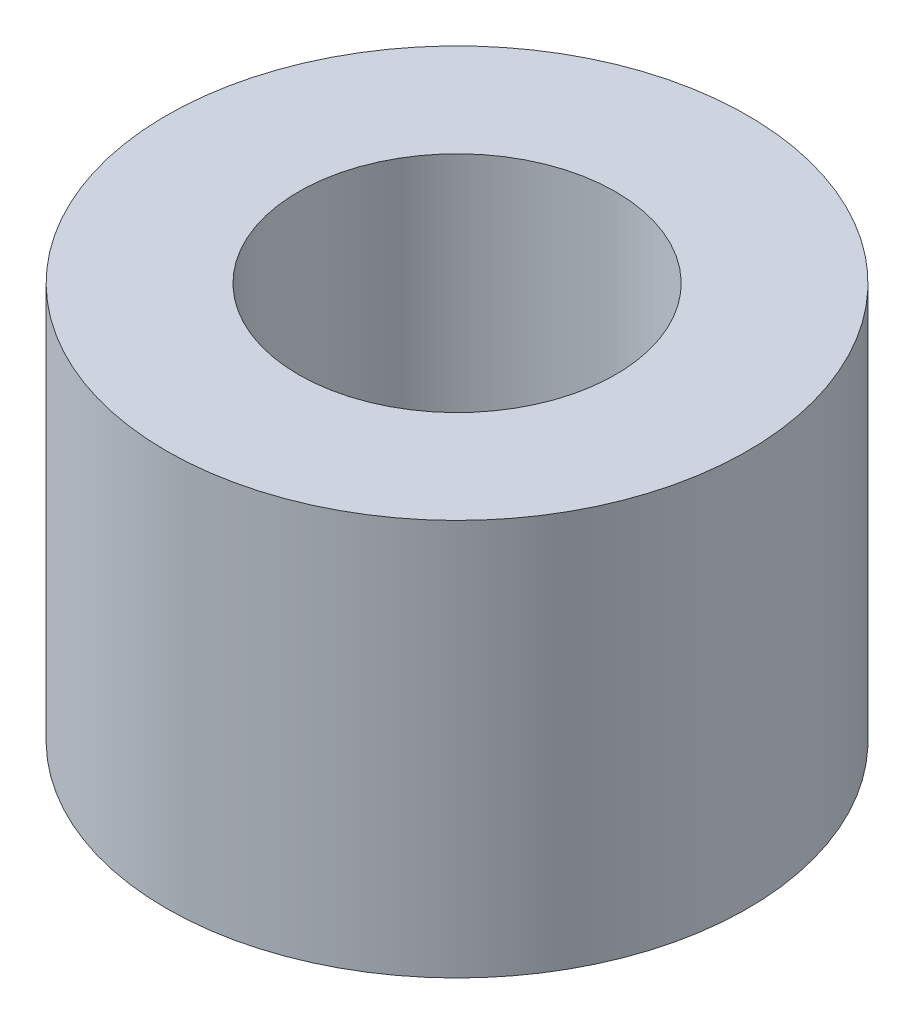
ISO-10303-21;
HEADER;
FILE_DESCRIPTION(('STEP AP214'),'2;1');
FILE_NAME('part.step','',(''),(''),'','','');
FILE_SCHEMA(('AUTOMOTIVE_DESIGN { 1 0 10303 214 1 1 1 1 }'));
ENDSEC;
DATA;
#1=APPLICATION_CONTEXT('core data for automotive mechanical design processes');
#2=APPLICATION_PROTOCOL_DEFINITION('international standard','automotive_design',2000,#1);
#3=PRODUCT_CONTEXT('',#1,'mechanical');
#4=PRODUCT('Part','Part','',(#3));
#5=PRODUCT_RELATED_PRODUCT_CATEGORY('part','',(#4));
#6=PRODUCT_DEFINITION_FORMATION('','',#4);
#7=PRODUCT_DEFINITION_CONTEXT('part definition',#1,'design');
#8=PRODUCT_DEFINITION('design','',#6,#7);
#9=PRODUCT_DEFINITION_SHAPE('','',#8);
#10=(LENGTH_UNIT() NAMED_UNIT(*) SI_UNIT(.MILLI.,.METRE.));
#11=(NAMED_UNIT(*) PLANE_ANGLE_UNIT() SI_UNIT($,.RADIAN.));
#12=(NAMED_UNIT(*) SI_UNIT($,.STERADIAN.) SOLID_ANGLE_UNIT());
#13=UNCERTAINTY_MEASURE_WITH_UNIT(LENGTH_MEASURE(1.E-05),#10,'distance_accuracy_value','');
#14=(GEOMETRIC_REPRESENTATION_CONTEXT(3) GLOBAL_UNCERTAINTY_ASSIGNED_CONTEXT((#13)) GLOBAL_UNIT_ASSIGNED_CONTEXT((#10,
#11,#12)) REPRESENTATION_CONTEXT('',''));
#15=CARTESIAN_POINT('',(0.,0.,0.));
#16=DIRECTION('',(0.,0.,1.));
#17=DIRECTION('',(1.,0.,0.));
#18=AXIS2_PLACEMENT_3D('',#15,#16,#17);
#19=CARTESIAN_POINT('',(0.,15.,0.));
#20=DIRECTION('',(0.,1.,0.));
#21=DIRECTION('',(0.,0.,1.));
#22=AXIS2_PLACEMENT_3D('',#19,#20,#21);
#23=PLANE('',#22);
#24=CARTESIAN_POINT('',(0.,15.,0.));
#25=DIRECTION('',(0.,1.,0.));
#26=DIRECTION('',(0.,0.,1.));
#27=AXIS2_PLACEMENT_3D('',#24,#25,#26);
#28=CIRCLE('',#27,11.);
#29=CARTESIAN_POINT('',(0.,15.,11.));
#30=VERTEX_POINT('',#29);
#31=EDGE_CURVE('E10',#30,#30,#28,.T.);
#32=ORIENTED_EDGE('',*,*,#31,.T.);
#33=EDGE_LOOP('',(#32));
#34=FACE_BOUND('',#33,.T.);
#35=CARTESIAN_POINT('',(0.,15.,0.));
#36=DIRECTION('',(0.,1.,0.));
#37=DIRECTION('',(0.,0.,1.));
#38=AXIS2_PLACEMENT_3D('',#35,#36,#37);
#39=CIRCLE('',#38,6.);
#40=CARTESIAN_POINT('',(0.,15.,6.));
#41=VERTEX_POINT('',#40);
#42=EDGE_CURVE('E52',#41,#41,#39,.T.);
#43=ORIENTED_EDGE('',*,*,#42,.F.);
#44=EDGE_LOOP('',(#43));
#45=FACE_BOUND('',#44,.T.);
#46=ADVANCED_FACE('F39',(#34,#45),#23,.T.);
#47=CARTESIAN_POINT('',(0.,0.,0.));
#48=DIRECTION('',(0.,1.,0.));
#49=DIRECTION('',(0.,0.,1.));
#50=AXIS2_PLACEMENT_3D('',#47,#48,#49);
#51=PLANE('',#50);
#52=CARTESIAN_POINT('',(0.,0.,0.));
#53=DIRECTION('',(0.,1.,0.));
#54=DIRECTION('',(0.,0.,1.));
#55=AXIS2_PLACEMENT_3D('',#52,#53,#54);
#56=CIRCLE('',#55,11.);
#57=CARTESIAN_POINT('',(0.,0.,11.));
#58=VERTEX_POINT('',#57);
#59=EDGE_CURVE('E43',#58,#58,#56,.T.);
#60=ORIENTED_EDGE('',*,*,#59,.F.);
#61=EDGE_LOOP('',(#60));
#62=FACE_BOUND('',#61,.T.);
#63=CARTESIAN_POINT('',(0.,0.,0.));
#64=DIRECTION('',(0.,1.,0.));
#65=DIRECTION('',(0.,0.,1.));
#66=AXIS2_PLACEMENT_3D('',#63,#64,#65);
#67=CIRCLE('',#66,6.);
#68=CARTESIAN_POINT('',(0.,0.,6.));
#69=VERTEX_POINT('',#68);
#70=EDGE_CURVE('E54',#69,#69,#67,.T.);
#71=ORIENTED_EDGE('',*,*,#70,.T.);
#72=EDGE_LOOP('',(#71));
#73=FACE_BOUND('',#72,.T.);
#74=ADVANCED_FACE('F66',(#62,#73),#51,.F.);
#75=CARTESIAN_POINT('',(0.,15.,0.));
#76=DIRECTION('',(0.,-1.,0.));
#77=DIRECTION('',(0.,0.,-1.));
#78=AXIS2_PLACEMENT_3D('',#75,#76,#77);
#79=CYLINDRICAL_SURFACE('',#78,11.);
#80=ORIENTED_EDGE('',*,*,#31,.F.);
#81=EDGE_LOOP('',(#80));
#82=FACE_BOUND('',#81,.T.);
#83=ORIENTED_EDGE('',*,*,#59,.T.);
#84=EDGE_LOOP('',(#83));
#85=FACE_BOUND('',#84,.T.);
#86=ADVANCED_FACE('F41',(#82,#85),#79,.T.);
#87=CARTESIAN_POINT('',(0.,15.,0.));
#88=DIRECTION('',(0.,-1.,0.));
#89=DIRECTION('',(0.,0.,-1.));
#90=AXIS2_PLACEMENT_3D('',#87,#88,#89);
#91=CYLINDRICAL_SURFACE('',#90,6.);
#92=ORIENTED_EDGE('',*,*,#42,.T.);
#93=EDGE_LOOP('',(#92));
#94=FACE_BOUND('',#93,.T.);
#95=ORIENTED_EDGE('',*,*,#70,.F.);
#96=EDGE_LOOP('',(#95));
#97=FACE_BOUND('',#96,.T.);
#98=ADVANCED_FACE('F62',(#94,#97),#91,.F.);
#99=CLOSED_SHELL('',(#46,#74,#86,#98));
#100=MANIFOLD_SOLID_BREP('B2',#99);
#101=ADVANCED_BREP_SHAPE_REPRESENTATION('',(#18,#100),#14);
#102=SHAPE_DEFINITION_REPRESENTATION(#9,#101);
ENDSEC;
END-ISO-10303-21;
